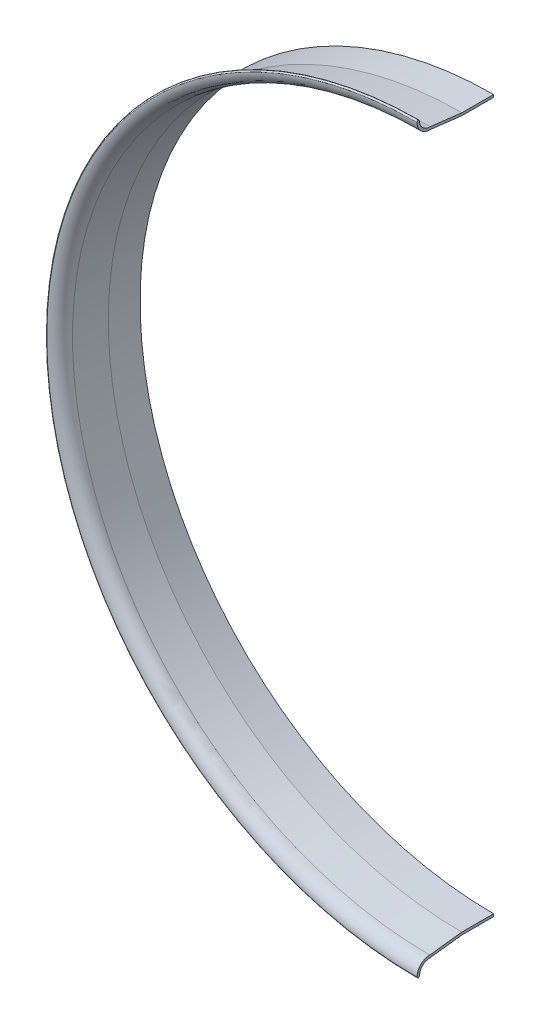
ISO-10303-21;
HEADER;
FILE_DESCRIPTION(('STEP AP214'),'2;1');
FILE_NAME('part.step','',(''),(''),'','','');
FILE_SCHEMA(('AUTOMOTIVE_DESIGN { 1 0 10303 214 1 1 1 1 }'));
ENDSEC;
DATA;
#1=APPLICATION_CONTEXT('core data for automotive mechanical design processes');
#2=APPLICATION_PROTOCOL_DEFINITION('international standard','automotive_design',2000,#1);
#3=PRODUCT_CONTEXT('',#1,'mechanical');
#4=PRODUCT('Part','Part','',(#3));
#5=PRODUCT_RELATED_PRODUCT_CATEGORY('part','',(#4));
#6=PRODUCT_DEFINITION_FORMATION('','',#4);
#7=PRODUCT_DEFINITION_CONTEXT('part definition',#1,'design');
#8=PRODUCT_DEFINITION('design','',#6,#7);
#9=PRODUCT_DEFINITION_SHAPE('','',#8);
#10=(LENGTH_UNIT() NAMED_UNIT(*) SI_UNIT(.MILLI.,.METRE.));
#11=(NAMED_UNIT(*) PLANE_ANGLE_UNIT() SI_UNIT($,.RADIAN.));
#12=(NAMED_UNIT(*) SI_UNIT($,.STERADIAN.) SOLID_ANGLE_UNIT());
#13=UNCERTAINTY_MEASURE_WITH_UNIT(LENGTH_MEASURE(1.E-05),#10,'distance_accuracy_value','');
#14=(GEOMETRIC_REPRESENTATION_CONTEXT(3) GLOBAL_UNCERTAINTY_ASSIGNED_CONTEXT((#13)) GLOBAL_UNIT_ASSIGNED_CONTEXT((#10,
#11,#12)) REPRESENTATION_CONTEXT('',''));
#15=CARTESIAN_POINT('',(0.,0.,0.));
#16=DIRECTION('',(0.,0.,1.));
#17=DIRECTION('',(1.,0.,0.));
#18=AXIS2_PLACEMENT_3D('',#15,#16,#17);
#19=CARTESIAN_POINT('',(-300.,806.324889124709,-377.357743681072));
#20=DIRECTION('',(0.,0.,-1.));
#21=DIRECTION('',(-1.,0.,0.));
#22=AXIS2_PLACEMENT_3D('',#19,#20,#21);
#23=PLANE('',#22);
#24=DIRECTION('',(0.,1.,0.));
#25=VECTOR('',#24,1.);
#26=CARTESIAN_POINT('',(-300.,806.324889124709,-377.357743681072));
#27=LINE('',#26,#25);
#28=CARTESIAN_POINT('',(-300.,528.839135447735,-377.357743681072));
#29=VERTEX_POINT('',#28);
#30=CARTESIAN_POINT('',(-300.,527.839135447735,-377.357743681073));
#31=VERTEX_POINT('',#30);
#32=EDGE_CURVE('E91',#29,#31,#27,.F.);
#33=ORIENTED_EDGE('',*,*,#32,.T.);
#34=CARTESIAN_POINT('',(-300.,667.332012286222,-377.357743681073));
#35=DIRECTION('',(0.,0.,-1.));
#36=DIRECTION('',(-1.,0.,0.));
#37=AXIS2_PLACEMENT_3D('',#34,#35,#36);
#38=CIRCLE('',#37,139.492876838487);
#39=CARTESIAN_POINT('',(-300.,806.824889124709,-377.357743681073));
#40=VERTEX_POINT('',#39);
#41=EDGE_CURVE('E201',#40,#31,#38,.F.);
#42=ORIENTED_EDGE('',*,*,#41,.F.);
#43=DIRECTION('',(0.,1.,0.));
#44=VECTOR('',#43,1.);
#45=CARTESIAN_POINT('',(-300.,667.332012286222,-377.357743681073));
#46=LINE('',#45,#44);
#47=CARTESIAN_POINT('',(-300.,805.824889124709,-377.357743681073));
#48=VERTEX_POINT('',#47);
#49=EDGE_CURVE('E74',#40,#48,#46,.F.);
#50=ORIENTED_EDGE('',*,*,#49,.T.);
#51=CARTESIAN_POINT('',(-300.,667.332012286222,-377.357743681072));
#52=DIRECTION('',(0.,0.,-1.));
#53=DIRECTION('',(-1.,0.,0.));
#54=AXIS2_PLACEMENT_3D('',#51,#52,#53);
#55=CIRCLE('',#54,138.492876838487);
#56=EDGE_CURVE('E20',#48,#29,#55,.F.);
#57=ORIENTED_EDGE('',*,*,#56,.T.);
#58=EDGE_LOOP('',(#33,#42,#50,#57));
#59=FACE_BOUND('',#58,.T.);
#60=ADVANCED_FACE('F17',(#59),#23,.T.);
#61=CARTESIAN_POINT('',(-300.,667.332012286222,-352.357743681072));
#62=DIRECTION('',(0.,0.,-1.));
#63=DIRECTION('',(1.,0.,0.));
#64=AXIS2_PLACEMENT_3D('',#61,#62,#63);
#65=TOROIDAL_SURFACE('',#64,145.,5.00000000000023);
#66=CARTESIAN_POINT('',(-300.,522.332012286222,-347.357743681072));
#67=CARTESIAN_POINT('',(-300.,522.472642581045,-347.357728558728));
#68=CARTESIAN_POINT('',(-300.,522.613270705351,-347.363676110227));
#69=CARTESIAN_POINT('',(-300.,522.893520792679,-347.387387339161));
#70=CARTESIAN_POINT('',(-300.,523.033142803642,-347.405150449782));
#71=CARTESIAN_POINT('',(-300.,523.310287779183,-347.452365749533));
#72=CARTESIAN_POINT('',(-300.,523.447812250119,-347.481809096047));
#73=CARTESIAN_POINT('',(-300.,523.719891805086,-347.55217068475));
#74=CARTESIAN_POINT('',(-300.,523.854446925343,-347.593088786863));
#75=CARTESIAN_POINT('',(-300.,524.119673682135,-347.686124721628));
#76=CARTESIAN_POINT('',(-300.,524.250344131126,-347.738245939796));
#77=CARTESIAN_POINT('',(-300.,524.506877708584,-347.853331288322));
#78=CARTESIAN_POINT('',(-300.,524.632739042234,-347.916299419499));
#79=CARTESIAN_POINT('',(-300.,524.878640900765,-348.052580262102));
#80=CARTESIAN_POINT('',(-300.,524.998684561552,-348.12588731529));
#81=CARTESIAN_POINT('',(-300.,525.232214595274,-348.282379852083));
#82=CARTESIAN_POINT('',(-300.,525.345698536754,-348.365568964154));
#83=CARTESIAN_POINT('',(-300.,525.56521243867,-348.541179045758));
#84=CARTESIAN_POINT('',(-300.,525.671245215646,-348.63359649465));
#85=CARTESIAN_POINT('',(-300.,525.875188855312,-348.827069057312));
#86=CARTESIAN_POINT('',(-300.,525.973096677694,-348.92812737598));
#87=CARTESIAN_POINT('',(-300.,526.160034351685,-349.138115763281));
#88=CARTESIAN_POINT('',(-300.,526.249065692304,-349.247044506363));
#89=CARTESIAN_POINT('',(-300.,526.417666269176,-349.472054405383));
#90=CARTESIAN_POINT('',(-300.,526.497232129286,-349.588138091064));
#91=CARTESIAN_POINT('',(-300.,526.646300220788,-349.826599527022));
#92=CARTESIAN_POINT('',(-300.,526.715802290651,-349.948977378281));
#93=CARTESIAN_POINT('',(-300.,526.84424702556,-350.199153663374));
#94=CARTESIAN_POINT('',(-300.,526.903189645502,-350.326952120358));
#95=CARTESIAN_POINT('',(-300.,527.010070623414,-350.587004097603));
#96=CARTESIAN_POINT('',(-300.,527.058014260375,-350.719255445587));
#97=CARTESIAN_POINT('',(-300.,527.142581624095,-350.987277346275));
#98=CARTESIAN_POINT('',(-300.,527.179207815794,-351.123047125672));
#99=CARTESIAN_POINT('',(-300.,527.250563547278,-351.44020688972));
#100=CARTESIAN_POINT('',(-300.,527.281105813916,-351.622566217383));
#101=CARTESIAN_POINT('',(-300.,527.311646100316,-351.89756922671));
#102=CARTESIAN_POINT('',(-300.,527.319280670106,-351.989434189277));
#103=CARTESIAN_POINT('',(-300.,527.329463150097,-352.173439795945));
#104=CARTESIAN_POINT('',(-300.,527.332011382198,-352.265580422229));
#105=CARTESIAN_POINT('',(-300.,527.332012286222,-352.357743681046));
#106=B_SPLINE_CURVE_WITH_KNOTS('',3,(#66,#67,#68,#69,#70,#71,#72,#73,#74,#75,#76,#77,#78,#79,
#80,#81,#82,#83,#84,#85,#86,#87,#88,#89,#90,#91,#92,#93,#94,#95,#96,#97,#98,#99,#100,#101,#102,
#103,#104,#105),.UNSPECIFIED.,.F.,.F.,(4,2,2,2,2,2,2,2,2,2,2,2,2,2,2,2,2,2,2,4),(0.,
0.421762112767258,0.843503994288263,1.26492720019783,1.68634526193841,2.10789085327994,
2.52959226338537,2.95106377581064,3.37269052404633,3.79415703039231,4.21578054240918,
4.637333208632,5.059035786153,5.48074513148523,5.90245627805129,6.32396459780819,
6.74538104818502,7.29879231270315,7.57521919594098,7.85162858444298),.UNSPECIFIED.);
#107=CARTESIAN_POINT('',(-300.,522.332012286222,-347.357743681072));
#108=VERTEX_POINT('',#107);
#109=CARTESIAN_POINT('',(-300.,527.332012286216,-352.357743681008));
#110=VERTEX_POINT('',#109);
#111=EDGE_CURVE('E105',#108,#110,#106,.T.);
#112=ORIENTED_EDGE('',*,*,#111,.T.);
#113=CARTESIAN_POINT('',(-300.,667.332012286222,-352.357743680969));
#114=DIRECTION('',(0.,0.,1.));
#115=DIRECTION('',(0.,-1.,0.));
#116=AXIS2_PLACEMENT_3D('',#113,#114,#115);
#117=CIRCLE('',#116,139.999999999142);
#118=CARTESIAN_POINT('',(-300.,807.332012285799,-352.357743680969));
#119=VERTEX_POINT('',#118);
#120=EDGE_CURVE('E97',#110,#119,#117,.F.);
#121=ORIENTED_EDGE('',*,*,#120,.T.);
#122=CARTESIAN_POINT('',(-300.,807.332012286222,-352.357743681046));
#123=CARTESIAN_POINT('',(-300.,807.331997163879,-352.217113386223));
#124=CARTESIAN_POINT('',(-300.,807.337944715379,-352.076485261918));
#125=CARTESIAN_POINT('',(-300.,807.361655944314,-351.79623517459));
#126=CARTESIAN_POINT('',(-300.,807.379419054936,-351.656613163627));
#127=CARTESIAN_POINT('',(-300.,807.426634354688,-351.379468188086));
#128=CARTESIAN_POINT('',(-300.,807.456077701203,-351.24194371715));
#129=CARTESIAN_POINT('',(-300.,807.526439289907,-350.969864162183));
#130=CARTESIAN_POINT('',(-300.,807.567357392021,-350.835309041926));
#131=CARTESIAN_POINT('',(-300.,807.660393326787,-350.570082285135));
#132=CARTESIAN_POINT('',(-300.,807.712514544956,-350.439411836144));
#133=CARTESIAN_POINT('',(-300.,807.827599893483,-350.182878258687));
#134=CARTESIAN_POINT('',(-300.,807.890568024661,-350.057016925037));
#135=CARTESIAN_POINT('',(-300.,808.026848867265,-349.811115066507));
#136=CARTESIAN_POINT('',(-300.,808.100155920454,-349.691071405721));
#137=CARTESIAN_POINT('',(-300.,808.256648457248,-349.457541371999));
#138=CARTESIAN_POINT('',(-300.,808.339837569319,-349.34405743052));
#139=CARTESIAN_POINT('',(-300.,808.515447650924,-349.124543528605));
#140=CARTESIAN_POINT('',(-300.,808.607865099817,-349.018510751629));
#141=CARTESIAN_POINT('',(-300.,808.80133766248,-348.814567111964));
#142=CARTESIAN_POINT('',(-300.,808.902395981149,-348.716659289582));
#143=CARTESIAN_POINT('',(-300.,809.112384368451,-348.529721615592));
#144=CARTESIAN_POINT('',(-300.,809.221313111533,-348.440690274974));
#145=CARTESIAN_POINT('',(-300.,809.446323010554,-348.272089698103));
#146=CARTESIAN_POINT('',(-300.,809.562406696236,-348.192523837994));
#147=CARTESIAN_POINT('',(-300.,809.800868132195,-348.043455746493));
#148=CARTESIAN_POINT('',(-300.,809.923245983454,-347.973953676631));
#149=CARTESIAN_POINT('',(-300.,810.173422268547,-347.845508941723));
#150=CARTESIAN_POINT('',(-300.,810.301220725532,-347.786566321782));
#151=CARTESIAN_POINT('',(-300.,810.561272702777,-347.679685343871));
#152=CARTESIAN_POINT('',(-300.,810.693524050761,-347.631741706911));
#153=CARTESIAN_POINT('',(-300.,810.96154595145,-347.547174343192));
#154=CARTESIAN_POINT('',(-300.,811.097315730847,-347.510548151494));
#155=CARTESIAN_POINT('',(-300.,811.414475494895,-347.439192420011));
#156=CARTESIAN_POINT('',(-300.,811.596834822559,-347.408650153374));
#157=CARTESIAN_POINT('',(-300.,811.871837831885,-347.378109866976));
#158=CARTESIAN_POINT('',(-300.,811.963702794453,-347.370475297187));
#159=CARTESIAN_POINT('',(-300.,812.14770840112,-347.360292817196));
#160=CARTESIAN_POINT('',(-300.,812.239849027404,-347.357744585096));
#161=CARTESIAN_POINT('',(-300.,812.332012286222,-347.357743681072));
#162=B_SPLINE_CURVE_WITH_KNOTS('',3,(#122,#123,#124,#125,#126,#127,#128,#129,#130,#131,#132,
#133,#134,#135,#136,#137,#138,#139,#140,#141,#142,#143,#144,#145,#146,#147,#148,#149,#150,#151,
#152,#153,#154,#155,#156,#157,#158,#159,#160,#161),.UNSPECIFIED.,.F.,.F.,(4,2,2,2,2,2,2,2,2,2,2,
2,2,2,2,2,2,2,2,4),(0.,0.421762112767128,0.843503994288192,1.26492720019781,1.6863452619384,
2.10789085327992,2.5295922633853,2.95106377581056,3.37269052404634,3.7941570303923,
4.21578054240917,4.63733320863185,5.05903578615287,5.48074513148511,5.90245627805114,
6.32396459780797,6.74538104818502,7.298792312703,7.57521919594083,7.8516285844429),.UNSPECIFIED.);
#163=CARTESIAN_POINT('',(-300.,812.332012286222,-347.357743681072));
#164=VERTEX_POINT('',#163);
#165=EDGE_CURVE('E132',#119,#164,#162,.T.);
#166=ORIENTED_EDGE('',*,*,#165,.T.);
#167=CARTESIAN_POINT('',(-300.,667.332012286222,-347.357743681072));
#168=DIRECTION('',(0.,0.,-1.));
#169=DIRECTION('',(1.,0.,0.));
#170=AXIS2_PLACEMENT_3D('',#167,#168,#169);
#171=CIRCLE('',#170,145.);
#172=EDGE_CURVE('E115',#108,#164,#171,.T.);
#173=ORIENTED_EDGE('',*,*,#172,.F.);
#174=EDGE_LOOP('',(#112,#121,#166,#173));
#175=FACE_BOUND('',#174,.T.);
#176=ADVANCED_FACE('F116',(#175),#65,.T.);
#177=CARTESIAN_POINT('',(-300.,667.332012286222,-352.357743680969));
#178=DIRECTION('',(0.,0.,1.));
#179=DIRECTION('',(1.,0.,0.));
#180=AXIS2_PLACEMENT_3D('',#177,#178,#179);
#181=CONICAL_SURFACE('',#180,139.999999999142,0.119428925881825);
#182=ORIENTED_EDGE('',*,*,#120,.F.);
#183=DIRECTION('',(0.,0.119145220618415,-0.992876838486924));
#184=VECTOR('',#183,1.);
#185=CARTESIAN_POINT('',(-300.,527.332012286222,-352.357743681072));
#186=LINE('',#185,#184);
#187=CARTESIAN_POINT('',(-300.,528.839135447735,-364.917103360348));
#188=VERTEX_POINT('',#187);
#189=EDGE_CURVE('E87',#110,#188,#186,.T.);
#190=ORIENTED_EDGE('',*,*,#189,.T.);
#191=CARTESIAN_POINT('',(-300.,667.332012286222,-364.917103360348));
#192=DIRECTION('',(0.,0.,-1.));
#193=DIRECTION('',(-1.,0.,0.));
#194=AXIS2_PLACEMENT_3D('',#191,#192,#193);
#195=CIRCLE('',#194,138.492876838487);
#196=CARTESIAN_POINT('',(-300.,805.824889124709,-364.917103360365));
#197=VERTEX_POINT('',#196);
#198=EDGE_CURVE('E82',#188,#197,#195,.T.);
#199=ORIENTED_EDGE('',*,*,#198,.T.);
#200=DIRECTION('',(0.,0.119145220618346,0.992876838486932));
#201=VECTOR('',#200,1.);
#202=CARTESIAN_POINT('',(-300.,805.824889124709,-364.917103360348));
#203=LINE('',#202,#201);
#204=EDGE_CURVE('E140',#197,#119,#203,.T.);
#205=ORIENTED_EDGE('',*,*,#204,.T.);
#206=EDGE_LOOP('',(#182,#190,#199,#205));
#207=FACE_BOUND('',#206,.T.);
#208=ADVANCED_FACE('F120',(#207),#181,.F.);
#209=CARTESIAN_POINT('',(-300.,667.332012286222,-371.13742352071));
#210=DIRECTION('',(0.,0.,-1.));
#211=DIRECTION('',(-1.,0.,0.));
#212=AXIS2_PLACEMENT_3D('',#209,#210,#211);
#213=CYLINDRICAL_SURFACE('',#212,138.492876838487);
#214=ORIENTED_EDGE('',*,*,#198,.F.);
#215=DIRECTION('',(0.,0.,1.));
#216=VECTOR('',#215,1.);
#217=CARTESIAN_POINT('',(-300.,528.839135447735,-362.357906909287));
#218=LINE('',#217,#216);
#219=EDGE_CURVE('E94',#188,#29,#218,.F.);
#220=ORIENTED_EDGE('',*,*,#219,.T.);
#221=ORIENTED_EDGE('',*,*,#56,.F.);
#222=DIRECTION('',(0.,0.,1.));
#223=VECTOR('',#222,1.);
#224=CARTESIAN_POINT('',(-300.,805.824889124709,-362.357906909287));
#225=LINE('',#224,#223);
#226=EDGE_CURVE('E209',#48,#197,#225,.T.);
#227=ORIENTED_EDGE('',*,*,#226,.T.);
#228=EDGE_LOOP('',(#214,#220,#221,#227));
#229=FACE_BOUND('',#228,.T.);
#230=ADVANCED_FACE('F101',(#229),#213,.F.);
#231=CARTESIAN_POINT('',(-300.,667.332012286222,-347.857743681072));
#232=DIRECTION('',(0.,0.,-1.));
#233=DIRECTION('',(1.,0.,0.));
#234=AXIS2_PLACEMENT_3D('',#231,#232,#233);
#235=TOROIDAL_SURFACE('',#234,144.981768382937,0.500332281449674);
#236=CARTESIAN_POINT('',(-300.,522.332012286221,-348.357743681072));
#237=CARTESIAN_POINT('',(-300.,522.303883005038,-348.356741916397));
#238=CARTESIAN_POINT('',(-300.,522.275849094756,-348.353320441427));
#239=CARTESIAN_POINT('',(-300.,522.220766845723,-348.341843316062));
#240=CARTESIAN_POINT('',(-300.,522.193717800459,-348.333791060181));
#241=CARTESIAN_POINT('',(-300.,522.141344503937,-348.313250793962));
#242=CARTESIAN_POINT('',(-300.,522.116021059197,-348.300760726182));
#243=CARTESIAN_POINT('',(-300.,522.067834973355,-348.27171040344));
#244=CARTESIAN_POINT('',(-300.,522.044971851602,-348.255150945564));
#245=CARTESIAN_POINT('',(-300.,522.002362921578,-348.218439762148));
#246=CARTESIAN_POINT('',(-300.,521.982615242458,-348.198290208093));
#247=CARTESIAN_POINT('',(-300.,521.946754994804,-348.154933199128));
#248=CARTESIAN_POINT('',(-300.,521.930647562339,-348.131721495975));
#249=CARTESIAN_POINT('',(-300.,521.902571577642,-348.082939811595));
#250=CARTESIAN_POINT('',(-300.,521.890600014092,-348.057371563422));
#251=CARTESIAN_POINT('',(-300.,521.871118612048,-348.004586567069));
#252=CARTESIAN_POINT('',(-300.,521.863609037132,-347.977369721608));
#253=CARTESIAN_POINT('',(-300.,521.853266094516,-347.922062396304));
#254=CARTESIAN_POINT('',(-300.,521.850432588705,-347.893971942289));
#255=CARTESIAN_POINT('',(-300.,521.849521773931,-347.837714031256));
#256=CARTESIAN_POINT('',(-300.,521.851444465015,-347.809546574238));
#257=CARTESIAN_POINT('',(-300.,521.85999160999,-347.753933420549));
#258=CARTESIAN_POINT('',(-300.,521.866616202389,-347.726487745164));
#259=CARTESIAN_POINT('',(-300.,521.884378657921,-347.673099771388));
#260=CARTESIAN_POINT('',(-300.,521.89551625508,-347.647157384503));
#261=CARTESIAN_POINT('',(-300.,521.921998394949,-347.597492455086));
#262=CARTESIAN_POINT('',(-300.,521.93734599457,-347.573771542434));
#263=CARTESIAN_POINT('',(-300.,521.97178378807,-347.529276396817));
#264=CARTESIAN_POINT('',(-300.,521.990868726878,-347.508498096134));
#265=CARTESIAN_POINT('',(-300.,522.03226575058,-347.470428314747));
#266=CARTESIAN_POINT('',(-300.,522.054579512653,-347.453138657428));
#267=CARTESIAN_POINT('',(-300.,522.10179790665,-347.422543099455));
#268=CARTESIAN_POINT('',(-300.,522.126703456212,-347.409238616287));
#269=CARTESIAN_POINT('',(-300.,522.18085138021,-347.385955429167));
#270=CARTESIAN_POINT('',(-300.,522.210281145442,-347.376410237691));
#271=CARTESIAN_POINT('',(-300.,522.270439033847,-347.362843650897));
#272=CARTESIAN_POINT('',(-300.,522.301169305753,-347.358831796925));
#273=CARTESIAN_POINT('',(-300.,522.332012286222,-347.357743681072));
#274=B_SPLINE_CURVE_WITH_KNOTS('',3,(#236,#237,#238,#239,#240,#241,#242,#243,#244,#245,#246,
#247,#248,#249,#250,#251,#252,#253,#254,#255,#256,#257,#258,#259,#260,#261,#262,#263,#264,#265,
#266,#267,#268,#269,#270,#271,#272,#273),.UNSPECIFIED.,.F.,.F.,(4,2,2,2,2,2,2,2,2,2,2,2,2,2,2,2,
2,2,4),(0.,0.0843291520767879,0.168596566791182,0.252903100351499,0.337193133657283,
0.421432355801891,0.505789700237902,0.590085494168673,0.674386267113624,0.758684550141168,
0.842982833989918,0.927283601201485,1.01157940086566,1.09593657103669,1.18017596744785,
1.2644592792673,1.34877253430511,1.4410593673673,1.53350513602951),.UNSPECIFIED.);
#275=CARTESIAN_POINT('',(-300.,522.332012286222,-348.357743681072));
#276=VERTEX_POINT('',#275);
#277=EDGE_CURVE('E222',#276,#108,#274,.T.);
#278=ORIENTED_EDGE('',*,*,#277,.T.);
#279=ORIENTED_EDGE('',*,*,#172,.T.);
#280=CARTESIAN_POINT('',(-300.,812.332012286222,-347.357743681072));
#281=CARTESIAN_POINT('',(-300.,812.360141567405,-347.358745445747));
#282=CARTESIAN_POINT('',(-300.,812.388175477687,-347.362166920717));
#283=CARTESIAN_POINT('',(-300.,812.443257726721,-347.373644046082));
#284=CARTESIAN_POINT('',(-300.,812.470306771984,-347.381696301963));
#285=CARTESIAN_POINT('',(-300.,812.522680068506,-347.402236568181));
#286=CARTESIAN_POINT('',(-300.,812.548003513246,-347.414726635962));
#287=CARTESIAN_POINT('',(-300.,812.596189599089,-347.443776958703));
#288=CARTESIAN_POINT('',(-300.,812.619052720842,-347.46033641658));
#289=CARTESIAN_POINT('',(-300.,812.661661650865,-347.497047599995));
#290=CARTESIAN_POINT('',(-300.,812.681409329985,-347.51719715405));
#291=CARTESIAN_POINT('',(-300.,812.71726957764,-347.560554163015));
#292=CARTESIAN_POINT('',(-300.,812.733377010105,-347.583765866169));
#293=CARTESIAN_POINT('',(-300.,812.761452994802,-347.632547550548));
#294=CARTESIAN_POINT('',(-300.,812.773424558352,-347.658115798722));
#295=CARTESIAN_POINT('',(-300.,812.792905960396,-347.710900795075));
#296=CARTESIAN_POINT('',(-300.,812.800415535312,-347.738117640535));
#297=CARTESIAN_POINT('',(-300.,812.810758477929,-347.793424965839));
#298=CARTESIAN_POINT('',(-300.,812.81359198374,-347.821515419855));
#299=CARTESIAN_POINT('',(-300.,812.814502798513,-347.877773330887));
#300=CARTESIAN_POINT('',(-300.,812.812580107429,-347.905940787905));
#301=CARTESIAN_POINT('',(-300.,812.804032962455,-347.961553941595));
#302=CARTESIAN_POINT('',(-300.,812.797408370056,-347.98899961698));
#303=CARTESIAN_POINT('',(-300.,812.779645914524,-348.042387590756));
#304=CARTESIAN_POINT('',(-300.,812.768508317365,-348.06832997764));
#305=CARTESIAN_POINT('',(-300.,812.742026177496,-348.117994907057));
#306=CARTESIAN_POINT('',(-300.,812.726678577875,-348.141715819709));
#307=CARTESIAN_POINT('',(-300.,812.692240784374,-348.186210965327));
#308=CARTESIAN_POINT('',(-300.,812.673155845567,-348.20698926601));
#309=CARTESIAN_POINT('',(-300.,812.631758821865,-348.245059047397));
#310=CARTESIAN_POINT('',(-300.,812.609445059792,-348.262348704716));
#311=CARTESIAN_POINT('',(-300.,812.562226665795,-348.292944262689));
#312=CARTESIAN_POINT('',(-300.,812.537321116233,-348.306248745856));
#313=CARTESIAN_POINT('',(-300.,812.483173192235,-348.329531932977));
#314=CARTESIAN_POINT('',(-300.,812.453743427003,-348.339077124453));
#315=CARTESIAN_POINT('',(-300.,812.393585538598,-348.352643711247));
#316=CARTESIAN_POINT('',(-300.,812.362855266691,-348.356655565219));
#317=CARTESIAN_POINT('',(-300.,812.332012286222,-348.357743681072));
#318=B_SPLINE_CURVE_WITH_KNOTS('',3,(#280,#281,#282,#283,#284,#285,#286,#287,#288,#289,#290,
#291,#292,#293,#294,#295,#296,#297,#298,#299,#300,#301,#302,#303,#304,#305,#306,#307,#308,#309,
#310,#311,#312,#313,#314,#315,#316,#317),.UNSPECIFIED.,.F.,.F.,(4,2,2,2,2,2,2,2,2,2,2,2,2,2,2,2,
2,2,4),(0.,0.0843291520767678,0.168596566791024,0.252903100351391,0.337193133657201,
0.421432355801846,0.505789700237874,0.590085494168693,0.674386267113566,0.758684550141121,
0.842982833989864,0.927283601201405,1.01157940086553,1.09593657103664,1.18017596744777,
1.26445927926716,1.34877253430495,1.44105936736741,1.53350513602996),.UNSPECIFIED.);
#319=CARTESIAN_POINT('',(-300.,812.332012286222,-348.357743681072));
#320=VERTEX_POINT('',#319);
#321=EDGE_CURVE('E139',#164,#320,#318,.T.);
#322=ORIENTED_EDGE('',*,*,#321,.T.);
#323=CARTESIAN_POINT('',(-300.,667.332012286222,-348.357743681072));
#324=DIRECTION('',(0.,0.,-1.));
#325=DIRECTION('',(-1.,0.,0.));
#326=AXIS2_PLACEMENT_3D('',#323,#324,#325);
#327=CIRCLE('',#326,144.999999999999);
#328=EDGE_CURVE('E103',#320,#276,#327,.F.);
#329=ORIENTED_EDGE('',*,*,#328,.T.);
#330=EDGE_LOOP('',(#278,#279,#322,#329));
#331=FACE_BOUND('',#330,.T.);
#332=ADVANCED_FACE('F152',(#331),#235,.T.);
#333=CARTESIAN_POINT('',(-300.,667.332012286222,-362.357906909287));
#334=DIRECTION('',(-1.,0.,0.));
#335=DIRECTION('',(0.,0.,1.));
#336=AXIS2_PLACEMENT_3D('',#333,#334,#335);
#337=PLANE('',#336);
#338=CARTESIAN_POINT('',(-300.,808.324889124707,-352.476888901613));
#339=CARTESIAN_POINT('',(-300.,808.321928166929,-352.364019471609));
#340=CARTESIAN_POINT('',(-300.,808.323750926729,-352.251030135816));
#341=CARTESIAN_POINT('',(-300.,808.336901025665,-352.025611128141));
#342=CARTESIAN_POINT('',(-300.,808.348227908669,-351.913181429661));
#343=CARTESIAN_POINT('',(-300.,808.380310820745,-351.689755880422));
#344=CARTESIAN_POINT('',(-300.,808.401059612902,-351.578758996298));
#345=CARTESIAN_POINT('',(-300.,808.451813745912,-351.358935112237));
#346=CARTESIAN_POINT('',(-300.,808.481818973763,-351.250108085828));
#347=CARTESIAN_POINT('',(-300.,808.58548126192,-350.927930803141));
#348=CARTESIAN_POINT('',(-300.,808.672798115495,-350.718793070628));
#349=CARTESIAN_POINT('',(-300.,808.881247459728,-350.318295900738));
#350=CARTESIAN_POINT('',(-300.,809.002374477195,-350.126933592551));
#351=CARTESIAN_POINT('',(-300.,809.275045021517,-349.767226214829));
#352=CARTESIAN_POINT('',(-300.,809.426588754772,-349.598881301497));
#353=CARTESIAN_POINT('',(-300.,809.755812146159,-349.290005472516));
#354=CARTESIAN_POINT('',(-300.,809.933495675334,-349.149478683697));
#355=CARTESIAN_POINT('',(-300.,810.309944003044,-348.900236090284));
#356=CARTESIAN_POINT('',(-300.,810.508711623125,-348.79152455065));
#357=CARTESIAN_POINT('',(-300.,810.921655508731,-348.60905203171));
#358=CARTESIAN_POINT('',(-300.,811.13582532757,-348.535276526652));
#359=CARTESIAN_POINT('',(-300.,811.514259372212,-348.439664397107));
#360=CARTESIAN_POINT('',(-300.,811.676396920904,-348.40918468317));
#361=CARTESIAN_POINT('',(-300.,812.003001131014,-348.368335081239));
#362=CARTESIAN_POINT('',(-300.,812.167464996812,-348.357942830392));
#363=CARTESIAN_POINT('',(-300.,812.332012286222,-348.357743681072));
#364=B_SPLINE_CURVE_WITH_KNOTS('',3,(#338,#339,#340,#341,#342,#343,#344,#345,#346,#347,#348,
#349,#350,#351,#352,#353,#354,#355,#356,#357,#358,#359,#360,#361,#362,#363),.UNSPECIFIED.,.F.,
.F.,(4,2,2,2,2,2,2,2,2,2,2,2,4),(0.,0.338614627018383,0.677213003788965,1.01555174382344,
1.35388635363205,2.03028239621903,2.70656900723666,3.38286020754141,4.05925166084639,
4.73573374562875,5.41193431427322,5.90568208717613,6.39887986615392),.UNSPECIFIED.);
#365=CARTESIAN_POINT('',(-300.,808.324889124281,-352.476888901601));
#366=VERTEX_POINT('',#365);
#367=EDGE_CURVE('E159',#366,#320,#364,.T.);
#368=ORIENTED_EDGE('',*,*,#367,.T.);
#369=ORIENTED_EDGE('',*,*,#321,.F.);
#370=ORIENTED_EDGE('',*,*,#165,.F.);
#371=ORIENTED_EDGE('',*,*,#204,.F.);
#372=ORIENTED_EDGE('',*,*,#226,.F.);
#373=ORIENTED_EDGE('',*,*,#49,.F.);
#374=DIRECTION('',(0.,0.,-1.));
#375=VECTOR('',#374,1.);
#376=CARTESIAN_POINT('',(-300.,806.824889124709,-371.167316291381));
#377=LINE('',#376,#375);
#378=CARTESIAN_POINT('',(-300.,806.824889125278,-364.976888901792));
#379=VERTEX_POINT('',#378);
#380=EDGE_CURVE('E198',#379,#40,#377,.T.);
#381=ORIENTED_EDGE('',*,*,#380,.F.);
#382=DIRECTION('',(0.,-0.119145220482945,-0.99287683850318));
#383=VECTOR('',#382,1.);
#384=CARTESIAN_POINT('',(-300.,807.574889124709,-358.72688890169));
#385=LINE('',#384,#383);
#386=EDGE_CURVE('E167',#366,#379,#385,.T.);
#387=ORIENTED_EDGE('',*,*,#386,.F.);
#388=EDGE_LOOP('',(#368,#369,#370,#371,#372,#373,#381,#387));
#389=FACE_BOUND('',#388,.T.);
#390=ADVANCED_FACE('F147',(#389),#337,.F.);
#391=CARTESIAN_POINT('',(-300.,667.332012286222,-371.167316291381));
#392=DIRECTION('',(0.,0.,-1.));
#393=DIRECTION('',(-1.,0.,0.));
#394=AXIS2_PLACEMENT_3D('',#391,#392,#393);
#395=CYLINDRICAL_SURFACE('',#394,139.492876838487);
#396=DIRECTION('',(0.,0.,1.));
#397=VECTOR('',#396,1.);
#398=CARTESIAN_POINT('',(-300.,527.839135447735,-362.357906909287));
#399=LINE('',#398,#397);
#400=CARTESIAN_POINT('',(-300.,527.839135447167,-364.976888901792));
#401=VERTEX_POINT('',#400);
#402=EDGE_CURVE('E95',#31,#401,#399,.T.);
#403=ORIENTED_EDGE('',*,*,#402,.T.);
#404=CARTESIAN_POINT('',(-300.,667.332012286222,-364.976888901792));
#405=DIRECTION('',(0.,0.,1.));
#406=DIRECTION('',(0.,-1.,0.));
#407=AXIS2_PLACEMENT_3D('',#404,#405,#406);
#408=CIRCLE('',#407,139.49287683934);
#409=EDGE_CURVE('E189',#379,#401,#408,.T.);
#410=ORIENTED_EDGE('',*,*,#409,.F.);
#411=ORIENTED_EDGE('',*,*,#380,.T.);
#412=ORIENTED_EDGE('',*,*,#41,.T.);
#413=EDGE_LOOP('',(#403,#410,#411,#412));
#414=FACE_BOUND('',#413,.T.);
#415=ADVANCED_FACE('F151',(#414),#395,.T.);
#416=CARTESIAN_POINT('',(-300.,667.332012286222,-362.357906909287));
#417=DIRECTION('',(-1.,0.,0.));
#418=DIRECTION('',(0.,0.,1.));
#419=AXIS2_PLACEMENT_3D('',#416,#417,#418);
#420=PLANE('',#419);
#421=ORIENTED_EDGE('',*,*,#402,.F.);
#422=ORIENTED_EDGE('',*,*,#32,.F.);
#423=ORIENTED_EDGE('',*,*,#219,.F.);
#424=ORIENTED_EDGE('',*,*,#189,.F.);
#425=ORIENTED_EDGE('',*,*,#111,.F.);
#426=ORIENTED_EDGE('',*,*,#277,.F.);
#427=CARTESIAN_POINT('',(-300.,522.332012286221,-348.357743681072));
#428=CARTESIAN_POINT('',(-300.,522.444920446115,-348.35789510764));
#429=CARTESIAN_POINT('',(-300.,522.557816602491,-348.362831739238));
#430=CARTESIAN_POINT('',(-300.,522.782787469145,-348.382190542922));
#431=CARTESIAN_POINT('',(-300.,522.894862218584,-348.396612259782));
#432=CARTESIAN_POINT('',(-300.,523.117318499059,-348.434841732407));
#433=CARTESIAN_POINT('',(-300.,523.227701262555,-348.458642282492));
#434=CARTESIAN_POINT('',(-300.,523.446042572032,-348.515436600844));
#435=CARTESIAN_POINT('',(-300.,523.55400114759,-348.548430256884));
#436=CARTESIAN_POINT('',(-300.,523.873198542852,-348.66093400937));
#437=CARTESIAN_POINT('',(-300.,524.079849905688,-348.753982589784));
#438=CARTESIAN_POINT('',(-300.,524.474448959757,-348.973392477274));
#439=CARTESIAN_POINT('',(-300.,524.662399671578,-349.099748392376));
#440=CARTESIAN_POINT('',(-300.,525.014454168206,-349.382230701083));
#441=CARTESIAN_POINT('',(-300.,525.178557791179,-349.538357296706));
#442=CARTESIAN_POINT('',(-300.,525.478241168619,-349.875969785295));
#443=CARTESIAN_POINT('',(-300.,525.613816691119,-350.057459434076));
#444=CARTESIAN_POINT('',(-300.,525.852587732064,-350.440635116777));
#445=CARTESIAN_POINT('',(-300.,525.955778909393,-350.642323853605));
#446=CARTESIAN_POINT('',(-300.,526.126799243453,-351.060140701238));
#447=CARTESIAN_POINT('',(-300.,526.19464309812,-351.276262768209));
#448=CARTESIAN_POINT('',(-300.,526.279787316726,-351.657188571349));
#449=CARTESIAN_POINT('',(-300.,526.305786107934,-351.820104686309));
#450=CARTESIAN_POINT('',(-300.,526.337617303673,-352.147710814178));
#451=CARTESIAN_POINT('',(-300.,526.343472139621,-352.312398648965));
#452=CARTESIAN_POINT('',(-300.,526.339135447738,-352.476888901613));
#453=B_SPLINE_CURVE_WITH_KNOTS('',3,(#427,#428,#429,#430,#431,#432,#433,#434,#435,#436,#437,
#438,#439,#440,#441,#442,#443,#444,#445,#446,#447,#448,#449,#450,#451,#452),.UNSPECIFIED.,.F.,
.F.,(4,2,2,2,2,2,2,2,2,2,2,2,4),(0.,0.338614627018378,0.677213003789006,1.01555174382355,
1.35388635363224,2.03028239621929,2.70656900723687,3.38286020754149,4.05925166084654,
4.73573374562878,5.41193431427334,5.90568208717627,6.39887986615428),.UNSPECIFIED.);
#454=CARTESIAN_POINT('',(-300.,526.339135448163,-352.476888901601));
#455=VERTEX_POINT('',#454);
#456=EDGE_CURVE('E35',#276,#455,#453,.T.);
#457=ORIENTED_EDGE('',*,*,#456,.T.);
#458=DIRECTION('',(0.,0.119145220482945,-0.99287683850318));
#459=VECTOR('',#458,1.);
#460=CARTESIAN_POINT('',(-300.,527.089135447735,-358.72688890169));
#461=LINE('',#460,#459);
#462=EDGE_CURVE('E26',#401,#455,#461,.F.);
#463=ORIENTED_EDGE('',*,*,#462,.F.);
#464=EDGE_LOOP('',(#421,#422,#423,#424,#425,#426,#457,#463));
#465=FACE_BOUND('',#464,.T.);
#466=ADVANCED_FACE('F92',(#465),#420,.F.);
#467=CARTESIAN_POINT('',(-300.,667.332012286222,-352.372001574735));
#468=DIRECTION('',(0.,0.,-1.));
#469=DIRECTION('',(-1.,0.,0.));
#470=AXIS2_PLACEMENT_3D('',#467,#468,#469);
#471=TOROIDAL_SURFACE('',#470,145.005768359504,4.01426203813484);
#472=CARTESIAN_POINT('',(-300.,667.332012286222,-352.476888901589));
#473=DIRECTION('',(0.,0.,1.));
#474=DIRECTION('',(0.,-1.,0.));
#475=AXIS2_PLACEMENT_3D('',#472,#473,#474);
#476=CIRCLE('',#475,140.992876837634);
#477=EDGE_CURVE('E11',#455,#366,#476,.F.);
#478=ORIENTED_EDGE('',*,*,#477,.F.);
#479=ORIENTED_EDGE('',*,*,#456,.F.);
#480=ORIENTED_EDGE('',*,*,#328,.F.);
#481=ORIENTED_EDGE('',*,*,#367,.F.);
#482=EDGE_LOOP('',(#478,#479,#480,#481));
#483=FACE_BOUND('',#482,.T.);
#484=ADVANCED_FACE('F174',(#483),#471,.F.);
#485=CARTESIAN_POINT('',(-300.,667.332012286222,-352.476888901588));
#486=DIRECTION('',(0.,0.,1.));
#487=DIRECTION('',(1.,0.,0.));
#488=AXIS2_PLACEMENT_3D('',#485,#486,#487);
#489=CONICAL_SURFACE('',#488,140.992876837634,0.119428925881882);
#490=ORIENTED_EDGE('',*,*,#462,.T.);
#491=ORIENTED_EDGE('',*,*,#477,.T.);
#492=ORIENTED_EDGE('',*,*,#386,.T.);
#493=ORIENTED_EDGE('',*,*,#409,.T.);
#494=EDGE_LOOP('',(#490,#491,#492,#493));
#495=FACE_BOUND('',#494,.T.);
#496=ADVANCED_FACE('F179',(#495),#489,.T.);
#497=CLOSED_SHELL('',(#60,#176,#208,#230,#332,#390,#415,#466,#484,#496));
#498=MANIFOLD_SOLID_BREP('B1',#497);
#499=ADVANCED_BREP_SHAPE_REPRESENTATION('',(#18,#498),#14);
#500=SHAPE_DEFINITION_REPRESENTATION(#9,#499);
ENDSEC;
END-ISO-10303-21;
